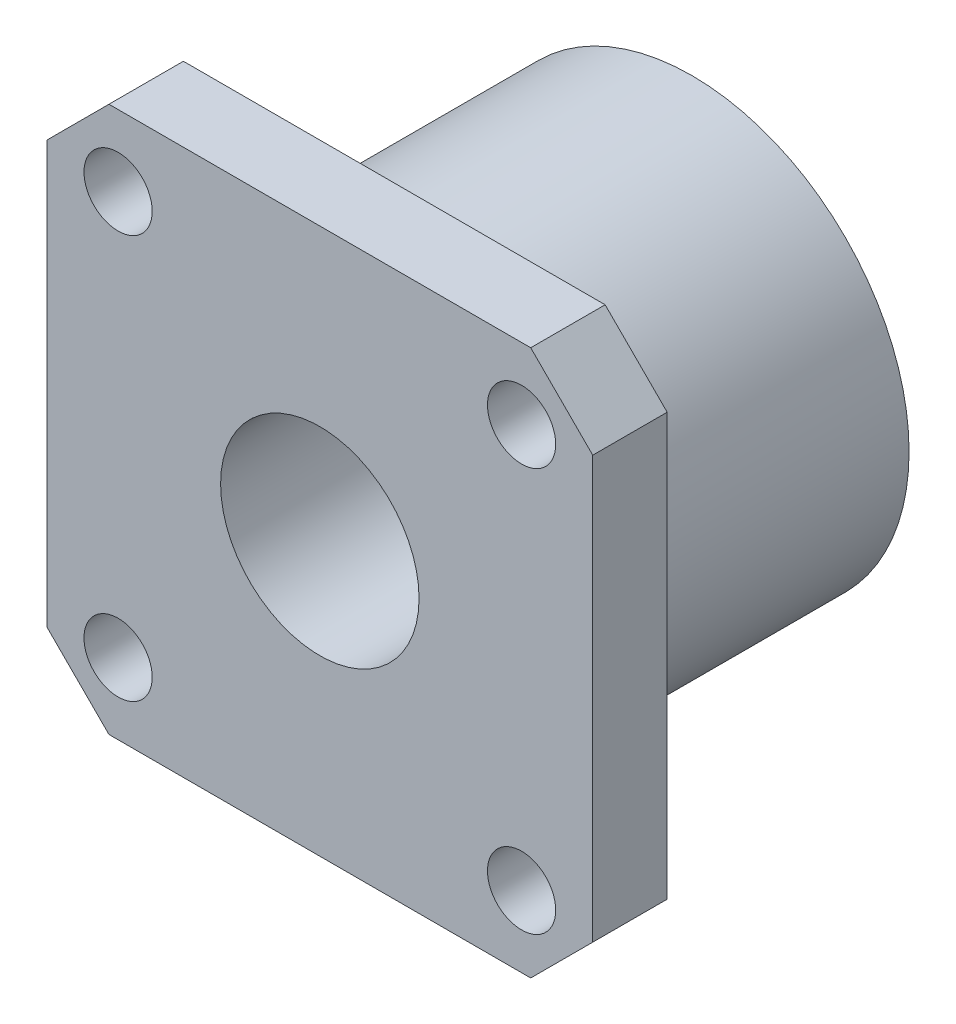
ISO-10303-21;
HEADER;
FILE_DESCRIPTION(('STEP AP214'),'2;1');
FILE_NAME('part.step','',(''),(''),'','','');
FILE_SCHEMA(('AUTOMOTIVE_DESIGN { 1 0 10303 214 1 1 1 1 }'));
ENDSEC;
DATA;
#1=APPLICATION_CONTEXT('core data for automotive mechanical design processes');
#2=APPLICATION_PROTOCOL_DEFINITION('international standard','automotive_design',2000,#1);
#3=PRODUCT_CONTEXT('',#1,'mechanical');
#4=PRODUCT('Part','Part','',(#3));
#5=PRODUCT_RELATED_PRODUCT_CATEGORY('part','',(#4));
#6=PRODUCT_DEFINITION_FORMATION('','',#4);
#7=PRODUCT_DEFINITION_CONTEXT('part definition',#1,'design');
#8=PRODUCT_DEFINITION('design','',#6,#7);
#9=PRODUCT_DEFINITION_SHAPE('','',#8);
#10=(LENGTH_UNIT() NAMED_UNIT(*) SI_UNIT(.MILLI.,.METRE.));
#11=(NAMED_UNIT(*) PLANE_ANGLE_UNIT() SI_UNIT($,.RADIAN.));
#12=(NAMED_UNIT(*) SI_UNIT($,.STERADIAN.) SOLID_ANGLE_UNIT());
#13=UNCERTAINTY_MEASURE_WITH_UNIT(LENGTH_MEASURE(1.E-05),#10,'distance_accuracy_value','');
#14=(GEOMETRIC_REPRESENTATION_CONTEXT(3) GLOBAL_UNCERTAINTY_ASSIGNED_CONTEXT((#13)) GLOBAL_UNIT_ASSIGNED_CONTEXT((#10,
#11,#12)) REPRESENTATION_CONTEXT('',''));
#15=CARTESIAN_POINT('',(0.,0.,0.));
#16=DIRECTION('',(0.,0.,1.));
#17=DIRECTION('',(1.,0.,0.));
#18=AXIS2_PLACEMENT_3D('',#15,#16,#17);
#19=CARTESIAN_POINT('',(0.,0.,6.));
#20=DIRECTION('',(0.,0.,1.));
#21=DIRECTION('',(1.,0.,0.));
#22=AXIS2_PLACEMENT_3D('',#19,#20,#21);
#23=PLANE('',#22);
#24=CARTESIAN_POINT('',(0.,0.,6.));
#25=DIRECTION('',(0.,0.,-1.));
#26=DIRECTION('',(-1.,0.,0.));
#27=AXIS2_PLACEMENT_3D('',#24,#25,#26);
#28=CIRCLE('',#27,8.);
#29=CARTESIAN_POINT('',(-8.,0.,6.));
#30=VERTEX_POINT('',#29);
#31=EDGE_CURVE('E369',#30,#30,#28,.T.);
#32=ORIENTED_EDGE('',*,*,#31,.T.);
#33=EDGE_LOOP('',(#32));
#34=FACE_BOUND('',#33,.T.);
#35=CARTESIAN_POINT('',(16.2634559672916,-16.2634559672896,6.));
#36=DIRECTION('',(0.,0.,1.));
#37=DIRECTION('',(1.,0.,0.));
#38=AXIS2_PLACEMENT_3D('',#35,#36,#37);
#39=CIRCLE('',#38,2.75);
#40=CARTESIAN_POINT('',(19.0134559672916,-16.2634559672896,6.));
#41=VERTEX_POINT('',#40);
#42=EDGE_CURVE('E201',#41,#41,#39,.T.);
#43=ORIENTED_EDGE('',*,*,#42,.F.);
#44=EDGE_LOOP('',(#43));
#45=FACE_BOUND('',#44,.T.);
#46=CARTESIAN_POINT('',(-16.2634559672906,16.2634559672906,6.));
#47=DIRECTION('',(0.,0.,1.));
#48=DIRECTION('',(1.,0.,0.));
#49=AXIS2_PLACEMENT_3D('',#46,#47,#48);
#50=CIRCLE('',#49,2.75);
#51=CARTESIAN_POINT('',(-13.5134559672906,16.2634559672906,6.));
#52=VERTEX_POINT('',#51);
#53=EDGE_CURVE('E139',#52,#52,#50,.T.);
#54=ORIENTED_EDGE('',*,*,#53,.F.);
#55=EDGE_LOOP('',(#54));
#56=FACE_BOUND('',#55,.T.);
#57=DIRECTION('',(0.,-1.,0.));
#58=VECTOR('',#57,1.);
#59=CARTESIAN_POINT('',(-22.,-22.,6.));
#60=LINE('',#59,#58);
#61=CARTESIAN_POINT('',(-22.,17.,6.));
#62=VERTEX_POINT('',#61);
#63=CARTESIAN_POINT('',(-22.,-17.,6.));
#64=VERTEX_POINT('',#63);
#65=EDGE_CURVE('E144',#62,#64,#60,.T.);
#66=ORIENTED_EDGE('',*,*,#65,.T.);
#67=DIRECTION('',(-0.707106781186546,0.707106781186549,0.));
#68=VECTOR('',#67,1.);
#69=CARTESIAN_POINT('',(-19.5,-19.5,6.));
#70=LINE('',#69,#68);
#71=CARTESIAN_POINT('',(-17.,-22.,6.));
#72=VERTEX_POINT('',#71);
#73=EDGE_CURVE('E159',#64,#72,#70,.F.);
#74=ORIENTED_EDGE('',*,*,#73,.T.);
#75=DIRECTION('',(1.,0.,0.));
#76=VECTOR('',#75,1.);
#77=CARTESIAN_POINT('',(22.,-22.,6.));
#78=LINE('',#77,#76);
#79=CARTESIAN_POINT('',(17.,-22.,6.));
#80=VERTEX_POINT('',#79);
#81=EDGE_CURVE('E126',#72,#80,#78,.T.);
#82=ORIENTED_EDGE('',*,*,#81,.T.);
#83=DIRECTION('',(-0.707106781186549,-0.707106781186546,0.));
#84=VECTOR('',#83,1.);
#85=CARTESIAN_POINT('',(19.5,-19.5,6.));
#86=LINE('',#85,#84);
#87=CARTESIAN_POINT('',(22.,-17.,6.));
#88=VERTEX_POINT('',#87);
#89=EDGE_CURVE('E157',#80,#88,#86,.F.);
#90=ORIENTED_EDGE('',*,*,#89,.T.);
#91=DIRECTION('',(0.,1.,0.));
#92=VECTOR('',#91,1.);
#93=CARTESIAN_POINT('',(22.,-22.,6.));
#94=LINE('',#93,#92);
#95=CARTESIAN_POINT('',(22.,17.,6.));
#96=VERTEX_POINT('',#95);
#97=EDGE_CURVE('E179',#88,#96,#94,.T.);
#98=ORIENTED_EDGE('',*,*,#97,.T.);
#99=DIRECTION('',(0.707106781186547,-0.707106781186549,0.));
#100=VECTOR('',#99,1.);
#101=CARTESIAN_POINT('',(19.5,19.5,6.));
#102=LINE('',#101,#100);
#103=CARTESIAN_POINT('',(17.,22.,6.));
#104=VERTEX_POINT('',#103);
#105=EDGE_CURVE('E61',#96,#104,#102,.F.);
#106=ORIENTED_EDGE('',*,*,#105,.T.);
#107=DIRECTION('',(-1.,0.,0.));
#108=VECTOR('',#107,1.);
#109=CARTESIAN_POINT('',(22.,22.,6.));
#110=LINE('',#109,#108);
#111=CARTESIAN_POINT('',(-17.,22.,6.));
#112=VERTEX_POINT('',#111);
#113=EDGE_CURVE('E145',#104,#112,#110,.T.);
#114=ORIENTED_EDGE('',*,*,#113,.T.);
#115=DIRECTION('',(0.707106781186549,0.707106781186546,0.));
#116=VECTOR('',#115,1.);
#117=CARTESIAN_POINT('',(-19.5,19.5,6.));
#118=LINE('',#117,#116);
#119=EDGE_CURVE('E154',#112,#62,#118,.F.);
#120=ORIENTED_EDGE('',*,*,#119,.T.);
#121=EDGE_LOOP('',(#66,#74,#82,#90,#98,#106,#114,#120));
#122=FACE_BOUND('',#121,.T.);
#123=CARTESIAN_POINT('',(16.2634559672906,16.2634559672916,6.));
#124=DIRECTION('',(0.,0.,1.));
#125=DIRECTION('',(1.,0.,0.));
#126=AXIS2_PLACEMENT_3D('',#123,#124,#125);
#127=CIRCLE('',#126,2.75);
#128=CARTESIAN_POINT('',(19.0134559672906,16.2634559672916,6.));
#129=VERTEX_POINT('',#128);
#130=EDGE_CURVE('E192',#129,#129,#127,.T.);
#131=ORIENTED_EDGE('',*,*,#130,.F.);
#132=EDGE_LOOP('',(#131));
#133=FACE_BOUND('',#132,.T.);
#134=CARTESIAN_POINT('',(-16.2634559672896,-16.2634559672906,6.));
#135=DIRECTION('',(0.,0.,1.));
#136=DIRECTION('',(1.,0.,0.));
#137=AXIS2_PLACEMENT_3D('',#134,#135,#136);
#138=CIRCLE('',#137,2.75);
#139=CARTESIAN_POINT('',(-13.5134559672896,-16.2634559672906,6.));
#140=VERTEX_POINT('',#139);
#141=EDGE_CURVE('E195',#140,#140,#138,.T.);
#142=ORIENTED_EDGE('',*,*,#141,.F.);
#143=EDGE_LOOP('',(#142));
#144=FACE_BOUND('',#143,.T.);
#145=ADVANCED_FACE('F38',(#34,#45,#56,#122,#133,#144),#23,.T.);
#146=CARTESIAN_POINT('',(0.,0.,0.));
#147=DIRECTION('',(0.,0.,1.));
#148=DIRECTION('',(1.,0.,0.));
#149=AXIS2_PLACEMENT_3D('',#146,#147,#148);
#150=PLANE('',#149);
#151=CARTESIAN_POINT('',(0.,0.,0.));
#152=DIRECTION('',(0.,0.,1.));
#153=DIRECTION('',(1.,0.,0.));
#154=AXIS2_PLACEMENT_3D('',#151,#152,#153);
#155=CIRCLE('',#154,17.5);
#156=CARTESIAN_POINT('',(17.5,0.,0.));
#157=VERTEX_POINT('',#156);
#158=EDGE_CURVE('E11',#157,#157,#155,.F.);
#159=ORIENTED_EDGE('',*,*,#158,.F.);
#160=EDGE_LOOP('',(#159));
#161=FACE_BOUND('',#160,.T.);
#162=DIRECTION('',(1.,0.,0.));
#163=VECTOR('',#162,1.);
#164=CARTESIAN_POINT('',(22.,-22.,0.));
#165=LINE('',#164,#163);
#166=CARTESIAN_POINT('',(-17.,-22.,0.));
#167=VERTEX_POINT('',#166);
#168=CARTESIAN_POINT('',(17.,-22.,0.));
#169=VERTEX_POINT('',#168);
#170=EDGE_CURVE('E123',#167,#169,#165,.T.);
#171=ORIENTED_EDGE('',*,*,#170,.F.);
#172=DIRECTION('',(0.707106781186546,-0.707106781186549,0.));
#173=VECTOR('',#172,1.);
#174=CARTESIAN_POINT('',(-17.,-22.,0.));
#175=LINE('',#174,#173);
#176=CARTESIAN_POINT('',(-22.,-17.,0.));
#177=VERTEX_POINT('',#176);
#178=EDGE_CURVE('E106',#167,#177,#175,.F.);
#179=ORIENTED_EDGE('',*,*,#178,.T.);
#180=DIRECTION('',(0.,-1.,0.));
#181=VECTOR('',#180,1.);
#182=CARTESIAN_POINT('',(-22.,-22.,0.));
#183=LINE('',#182,#181);
#184=CARTESIAN_POINT('',(-22.,17.,0.));
#185=VERTEX_POINT('',#184);
#186=EDGE_CURVE('E134',#185,#177,#183,.T.);
#187=ORIENTED_EDGE('',*,*,#186,.F.);
#188=DIRECTION('',(-0.707106781186549,-0.707106781186546,0.));
#189=VECTOR('',#188,1.);
#190=CARTESIAN_POINT('',(-22.,17.,0.));
#191=LINE('',#190,#189);
#192=CARTESIAN_POINT('',(-17.,22.,0.));
#193=VERTEX_POINT('',#192);
#194=EDGE_CURVE('E127',#185,#193,#191,.F.);
#195=ORIENTED_EDGE('',*,*,#194,.T.);
#196=DIRECTION('',(-1.,0.,0.));
#197=VECTOR('',#196,1.);
#198=CARTESIAN_POINT('',(22.,22.,0.));
#199=LINE('',#198,#197);
#200=CARTESIAN_POINT('',(17.,22.,0.));
#201=VERTEX_POINT('',#200);
#202=EDGE_CURVE('E137',#201,#193,#199,.T.);
#203=ORIENTED_EDGE('',*,*,#202,.F.);
#204=DIRECTION('',(-0.707106781186547,0.707106781186549,0.));
#205=VECTOR('',#204,1.);
#206=CARTESIAN_POINT('',(17.,22.,0.));
#207=LINE('',#206,#205);
#208=CARTESIAN_POINT('',(22.,17.,0.));
#209=VERTEX_POINT('',#208);
#210=EDGE_CURVE('E148',#201,#209,#207,.F.);
#211=ORIENTED_EDGE('',*,*,#210,.T.);
#212=DIRECTION('',(0.,1.,0.));
#213=VECTOR('',#212,1.);
#214=CARTESIAN_POINT('',(22.,-22.,0.));
#215=LINE('',#214,#213);
#216=CARTESIAN_POINT('',(22.,-17.,0.));
#217=VERTEX_POINT('',#216);
#218=EDGE_CURVE('E133',#217,#209,#215,.T.);
#219=ORIENTED_EDGE('',*,*,#218,.F.);
#220=DIRECTION('',(0.707106781186549,0.707106781186546,0.));
#221=VECTOR('',#220,1.);
#222=CARTESIAN_POINT('',(22.,-17.,0.));
#223=LINE('',#222,#221);
#224=EDGE_CURVE('E117',#217,#169,#223,.F.);
#225=ORIENTED_EDGE('',*,*,#224,.T.);
#226=EDGE_LOOP('',(#171,#179,#187,#195,#203,#211,#219,#225));
#227=FACE_BOUND('',#226,.T.);
#228=CARTESIAN_POINT('',(-16.2634559672906,16.2634559672906,0.));
#229=DIRECTION('',(0.,0.,1.));
#230=DIRECTION('',(1.,0.,0.));
#231=AXIS2_PLACEMENT_3D('',#228,#229,#230);
#232=CIRCLE('',#231,2.75);
#233=CARTESIAN_POINT('',(-13.5134559672906,16.2634559672906,0.));
#234=VERTEX_POINT('',#233);
#235=EDGE_CURVE('E182',#234,#234,#232,.T.);
#236=ORIENTED_EDGE('',*,*,#235,.T.);
#237=EDGE_LOOP('',(#236));
#238=FACE_BOUND('',#237,.T.);
#239=CARTESIAN_POINT('',(16.2634559672906,16.2634559672916,0.));
#240=DIRECTION('',(0.,0.,1.));
#241=DIRECTION('',(1.,0.,0.));
#242=AXIS2_PLACEMENT_3D('',#239,#240,#241);
#243=CIRCLE('',#242,2.75);
#244=CARTESIAN_POINT('',(19.0134559672906,16.2634559672916,0.));
#245=VERTEX_POINT('',#244);
#246=EDGE_CURVE('E210',#245,#245,#243,.T.);
#247=ORIENTED_EDGE('',*,*,#246,.T.);
#248=EDGE_LOOP('',(#247));
#249=FACE_BOUND('',#248,.T.);
#250=CARTESIAN_POINT('',(16.2634559672916,-16.2634559672896,0.));
#251=DIRECTION('',(0.,0.,1.));
#252=DIRECTION('',(1.,0.,0.));
#253=AXIS2_PLACEMENT_3D('',#250,#251,#252);
#254=CIRCLE('',#253,2.75);
#255=CARTESIAN_POINT('',(19.0134559672916,-16.2634559672896,0.));
#256=VERTEX_POINT('',#255);
#257=EDGE_CURVE('E197',#256,#256,#254,.T.);
#258=ORIENTED_EDGE('',*,*,#257,.T.);
#259=EDGE_LOOP('',(#258));
#260=FACE_BOUND('',#259,.T.);
#261=CARTESIAN_POINT('',(-16.2634559672896,-16.2634559672906,0.));
#262=DIRECTION('',(0.,0.,1.));
#263=DIRECTION('',(1.,0.,0.));
#264=AXIS2_PLACEMENT_3D('',#261,#262,#263);
#265=CIRCLE('',#264,2.75);
#266=CARTESIAN_POINT('',(-13.5134559672896,-16.2634559672906,0.));
#267=VERTEX_POINT('',#266);
#268=EDGE_CURVE('E198',#267,#267,#265,.T.);
#269=ORIENTED_EDGE('',*,*,#268,.T.);
#270=EDGE_LOOP('',(#269));
#271=FACE_BOUND('',#270,.T.);
#272=ADVANCED_FACE('F130',(#161,#227,#238,#249,#260,#271),#150,.F.);
#273=CARTESIAN_POINT('',(-22.,-22.,6.));
#274=DIRECTION('',(1.,0.,0.));
#275=DIRECTION('',(0.,0.,-1.));
#276=AXIS2_PLACEMENT_3D('',#273,#274,#275);
#277=PLANE('',#276);
#278=ORIENTED_EDGE('',*,*,#186,.T.);
#279=DIRECTION('',(0.,0.,1.));
#280=VECTOR('',#279,1.);
#281=CARTESIAN_POINT('',(-22.,-17.,6.));
#282=LINE('',#281,#280);
#283=EDGE_CURVE('E111',#177,#64,#282,.T.);
#284=ORIENTED_EDGE('',*,*,#283,.T.);
#285=ORIENTED_EDGE('',*,*,#65,.F.);
#286=DIRECTION('',(0.,0.,-1.));
#287=VECTOR('',#286,1.);
#288=CARTESIAN_POINT('',(-22.,17.,6.));
#289=LINE('',#288,#287);
#290=EDGE_CURVE('E116',#62,#185,#289,.T.);
#291=ORIENTED_EDGE('',*,*,#290,.T.);
#292=EDGE_LOOP('',(#278,#284,#285,#291));
#293=FACE_BOUND('',#292,.T.);
#294=ADVANCED_FACE('F176',(#293),#277,.F.);
#295=CARTESIAN_POINT('',(22.,-22.,6.));
#296=DIRECTION('',(0.,1.,0.));
#297=DIRECTION('',(-1.,0.,0.));
#298=AXIS2_PLACEMENT_3D('',#295,#296,#297);
#299=PLANE('',#298);
#300=ORIENTED_EDGE('',*,*,#81,.F.);
#301=DIRECTION('',(0.,0.,-1.));
#302=VECTOR('',#301,1.);
#303=CARTESIAN_POINT('',(-17.,-22.,6.));
#304=LINE('',#303,#302);
#305=EDGE_CURVE('E110',#72,#167,#304,.T.);
#306=ORIENTED_EDGE('',*,*,#305,.T.);
#307=ORIENTED_EDGE('',*,*,#170,.T.);
#308=DIRECTION('',(0.,0.,1.));
#309=VECTOR('',#308,1.);
#310=CARTESIAN_POINT('',(17.,-22.,6.));
#311=LINE('',#310,#309);
#312=EDGE_CURVE('E128',#169,#80,#311,.T.);
#313=ORIENTED_EDGE('',*,*,#312,.T.);
#314=EDGE_LOOP('',(#300,#306,#307,#313));
#315=FACE_BOUND('',#314,.T.);
#316=ADVANCED_FACE('F122',(#315),#299,.F.);
#317=CARTESIAN_POINT('',(22.,-22.,6.));
#318=DIRECTION('',(-1.,0.,0.));
#319=DIRECTION('',(0.,0.,1.));
#320=AXIS2_PLACEMENT_3D('',#317,#318,#319);
#321=PLANE('',#320);
#322=ORIENTED_EDGE('',*,*,#97,.F.);
#323=DIRECTION('',(0.,0.,-1.));
#324=VECTOR('',#323,1.);
#325=CARTESIAN_POINT('',(22.,-17.,6.));
#326=LINE('',#325,#324);
#327=EDGE_CURVE('E163',#88,#217,#326,.T.);
#328=ORIENTED_EDGE('',*,*,#327,.T.);
#329=ORIENTED_EDGE('',*,*,#218,.T.);
#330=DIRECTION('',(0.,0.,1.));
#331=VECTOR('',#330,1.);
#332=CARTESIAN_POINT('',(22.,17.,6.));
#333=LINE('',#332,#331);
#334=EDGE_CURVE('E161',#209,#96,#333,.T.);
#335=ORIENTED_EDGE('',*,*,#334,.T.);
#336=EDGE_LOOP('',(#322,#328,#329,#335));
#337=FACE_BOUND('',#336,.T.);
#338=ADVANCED_FACE('F232',(#337),#321,.F.);
#339=CARTESIAN_POINT('',(22.,22.,6.));
#340=DIRECTION('',(0.,-1.,0.));
#341=DIRECTION('',(1.,0.,0.));
#342=AXIS2_PLACEMENT_3D('',#339,#340,#341);
#343=PLANE('',#342);
#344=ORIENTED_EDGE('',*,*,#113,.F.);
#345=DIRECTION('',(0.,0.,-1.));
#346=VECTOR('',#345,1.);
#347=CARTESIAN_POINT('',(17.,22.,6.));
#348=LINE('',#347,#346);
#349=EDGE_CURVE('E47',#104,#201,#348,.T.);
#350=ORIENTED_EDGE('',*,*,#349,.T.);
#351=ORIENTED_EDGE('',*,*,#202,.T.);
#352=DIRECTION('',(0.,0.,1.));
#353=VECTOR('',#352,1.);
#354=CARTESIAN_POINT('',(-17.,22.,6.));
#355=LINE('',#354,#353);
#356=EDGE_CURVE('E54',#193,#112,#355,.T.);
#357=ORIENTED_EDGE('',*,*,#356,.T.);
#358=EDGE_LOOP('',(#344,#350,#351,#357));
#359=FACE_BOUND('',#358,.T.);
#360=ADVANCED_FACE('F169',(#359),#343,.F.);
#361=CARTESIAN_POINT('',(-16.2634559672906,16.2634559672906,6.));
#362=DIRECTION('',(0.,0.,-1.));
#363=DIRECTION('',(-1.,0.,0.));
#364=AXIS2_PLACEMENT_3D('',#361,#362,#363);
#365=CYLINDRICAL_SURFACE('',#364,2.75);
#366=ORIENTED_EDGE('',*,*,#53,.T.);
#367=EDGE_LOOP('',(#366));
#368=FACE_BOUND('',#367,.T.);
#369=ORIENTED_EDGE('',*,*,#235,.F.);
#370=EDGE_LOOP('',(#369));
#371=FACE_BOUND('',#370,.T.);
#372=ADVANCED_FACE('F221',(#368,#371),#365,.F.);
#373=CARTESIAN_POINT('',(16.2634559672906,16.2634559672916,6.));
#374=DIRECTION('',(0.,0.,-1.));
#375=DIRECTION('',(-1.,0.,0.));
#376=AXIS2_PLACEMENT_3D('',#373,#374,#375);
#377=CYLINDRICAL_SURFACE('',#376,2.75);
#378=ORIENTED_EDGE('',*,*,#130,.T.);
#379=EDGE_LOOP('',(#378));
#380=FACE_BOUND('',#379,.T.);
#381=ORIENTED_EDGE('',*,*,#246,.F.);
#382=EDGE_LOOP('',(#381));
#383=FACE_BOUND('',#382,.T.);
#384=ADVANCED_FACE('F223',(#380,#383),#377,.F.);
#385=CARTESIAN_POINT('',(16.2634559672916,-16.2634559672896,6.));
#386=DIRECTION('',(0.,0.,-1.));
#387=DIRECTION('',(-1.,0.,0.));
#388=AXIS2_PLACEMENT_3D('',#385,#386,#387);
#389=CYLINDRICAL_SURFACE('',#388,2.75);
#390=ORIENTED_EDGE('',*,*,#42,.T.);
#391=EDGE_LOOP('',(#390));
#392=FACE_BOUND('',#391,.T.);
#393=ORIENTED_EDGE('',*,*,#257,.F.);
#394=EDGE_LOOP('',(#393));
#395=FACE_BOUND('',#394,.T.);
#396=ADVANCED_FACE('F229',(#392,#395),#389,.F.);
#397=CARTESIAN_POINT('',(-16.2634559672896,-16.2634559672906,6.));
#398=DIRECTION('',(0.,0.,-1.));
#399=DIRECTION('',(-1.,0.,0.));
#400=AXIS2_PLACEMENT_3D('',#397,#398,#399);
#401=CYLINDRICAL_SURFACE('',#400,2.75);
#402=ORIENTED_EDGE('',*,*,#141,.T.);
#403=EDGE_LOOP('',(#402));
#404=FACE_BOUND('',#403,.T.);
#405=ORIENTED_EDGE('',*,*,#268,.F.);
#406=EDGE_LOOP('',(#405));
#407=FACE_BOUND('',#406,.T.);
#408=ADVANCED_FACE('F253',(#404,#407),#401,.F.);
#409=CARTESIAN_POINT('',(-17.,-22.,6.));
#410=DIRECTION('',(0.707106781186549,0.707106781186546,0.));
#411=DIRECTION('',(0.,0.,-1.));
#412=AXIS2_PLACEMENT_3D('',#409,#410,#411);
#413=PLANE('',#412);
#414=ORIENTED_EDGE('',*,*,#73,.F.);
#415=ORIENTED_EDGE('',*,*,#283,.F.);
#416=ORIENTED_EDGE('',*,*,#178,.F.);
#417=ORIENTED_EDGE('',*,*,#305,.F.);
#418=EDGE_LOOP('',(#414,#415,#416,#417));
#419=FACE_BOUND('',#418,.T.);
#420=ADVANCED_FACE('F109',(#419),#413,.F.);
#421=CARTESIAN_POINT('',(22.,-17.,6.));
#422=DIRECTION('',(-0.707106781186546,0.707106781186549,0.));
#423=DIRECTION('',(0.,0.,-1.));
#424=AXIS2_PLACEMENT_3D('',#421,#422,#423);
#425=PLANE('',#424);
#426=ORIENTED_EDGE('',*,*,#89,.F.);
#427=ORIENTED_EDGE('',*,*,#312,.F.);
#428=ORIENTED_EDGE('',*,*,#224,.F.);
#429=ORIENTED_EDGE('',*,*,#327,.F.);
#430=EDGE_LOOP('',(#426,#427,#428,#429));
#431=FACE_BOUND('',#430,.T.);
#432=ADVANCED_FACE('F252',(#431),#425,.F.);
#433=CARTESIAN_POINT('',(17.,22.,6.));
#434=DIRECTION('',(-0.707106781186549,-0.707106781186547,0.));
#435=DIRECTION('',(0.,0.,-1.));
#436=AXIS2_PLACEMENT_3D('',#433,#434,#435);
#437=PLANE('',#436);
#438=ORIENTED_EDGE('',*,*,#105,.F.);
#439=ORIENTED_EDGE('',*,*,#334,.F.);
#440=ORIENTED_EDGE('',*,*,#210,.F.);
#441=ORIENTED_EDGE('',*,*,#349,.F.);
#442=EDGE_LOOP('',(#438,#439,#440,#441));
#443=FACE_BOUND('',#442,.T.);
#444=ADVANCED_FACE('F258',(#443),#437,.F.);
#445=CARTESIAN_POINT('',(-22.,17.,6.));
#446=DIRECTION('',(0.707106781186546,-0.707106781186549,0.));
#447=DIRECTION('',(0.,0.,-1.));
#448=AXIS2_PLACEMENT_3D('',#445,#446,#447);
#449=PLANE('',#448);
#450=ORIENTED_EDGE('',*,*,#119,.F.);
#451=ORIENTED_EDGE('',*,*,#356,.F.);
#452=ORIENTED_EDGE('',*,*,#194,.F.);
#453=ORIENTED_EDGE('',*,*,#290,.F.);
#454=EDGE_LOOP('',(#450,#451,#452,#453));
#455=FACE_BOUND('',#454,.T.);
#456=ADVANCED_FACE('F41',(#455),#449,.F.);
#457=CARTESIAN_POINT('',(0.,0.,-24.));
#458=DIRECTION('',(0.,0.,-1.));
#459=DIRECTION('',(-1.,0.,0.));
#460=AXIS2_PLACEMENT_3D('',#457,#458,#459);
#461=PLANE('',#460);
#462=CARTESIAN_POINT('',(0.,0.,-24.));
#463=DIRECTION('',(0.,0.,-1.));
#464=DIRECTION('',(-1.,0.,0.));
#465=AXIS2_PLACEMENT_3D('',#462,#463,#464);
#466=CIRCLE('',#465,17.5);
#467=CARTESIAN_POINT('',(-17.5,0.,-24.));
#468=VERTEX_POINT('',#467);
#469=EDGE_CURVE('E204',#468,#468,#466,.T.);
#470=ORIENTED_EDGE('',*,*,#469,.T.);
#471=EDGE_LOOP('',(#470));
#472=FACE_BOUND('',#471,.T.);
#473=CARTESIAN_POINT('',(0.,0.,-24.));
#474=DIRECTION('',(0.,0.,-1.));
#475=DIRECTION('',(-1.,0.,0.));
#476=AXIS2_PLACEMENT_3D('',#473,#474,#475);
#477=CIRCLE('',#476,8.);
#478=CARTESIAN_POINT('',(-8.,0.,-24.));
#479=VERTEX_POINT('',#478);
#480=EDGE_CURVE('E366',#479,#479,#477,.T.);
#481=ORIENTED_EDGE('',*,*,#480,.F.);
#482=EDGE_LOOP('',(#481));
#483=FACE_BOUND('',#482,.T.);
#484=ADVANCED_FACE('F266',(#472,#483),#461,.T.);
#485=CARTESIAN_POINT('',(0.,0.,-24.));
#486=DIRECTION('',(0.,0.,1.));
#487=DIRECTION('',(1.,0.,0.));
#488=AXIS2_PLACEMENT_3D('',#485,#486,#487);
#489=CYLINDRICAL_SURFACE('',#488,17.5);
#490=ORIENTED_EDGE('',*,*,#469,.F.);
#491=EDGE_LOOP('',(#490));
#492=FACE_BOUND('',#491,.T.);
#493=ORIENTED_EDGE('',*,*,#158,.T.);
#494=EDGE_LOOP('',(#493));
#495=FACE_BOUND('',#494,.T.);
#496=ADVANCED_FACE('F274',(#492,#495),#489,.T.);
#497=CARTESIAN_POINT('',(0.,0.,-24.));
#498=DIRECTION('',(0.,0.,1.));
#499=DIRECTION('',(1.,0.,0.));
#500=AXIS2_PLACEMENT_3D('',#497,#498,#499);
#501=CYLINDRICAL_SURFACE('',#500,8.);
#502=ORIENTED_EDGE('',*,*,#480,.T.);
#503=EDGE_LOOP('',(#502));
#504=FACE_BOUND('',#503,.T.);
#505=ORIENTED_EDGE('',*,*,#31,.F.);
#506=EDGE_LOOP('',(#505));
#507=FACE_BOUND('',#506,.T.);
#508=ADVANCED_FACE('F280',(#504,#507),#501,.F.);
#509=CLOSED_SHELL('',(#145,#272,#294,#316,#338,#360,#372,#384,#396,#408,#420,#432,#444,#456,
#484,#496,#508));
#510=MANIFOLD_SOLID_BREP('B2',#509);
#511=ADVANCED_BREP_SHAPE_REPRESENTATION('',(#18,#510),#14);
#512=SHAPE_DEFINITION_REPRESENTATION(#9,#511);
ENDSEC;
END-ISO-10303-21;
